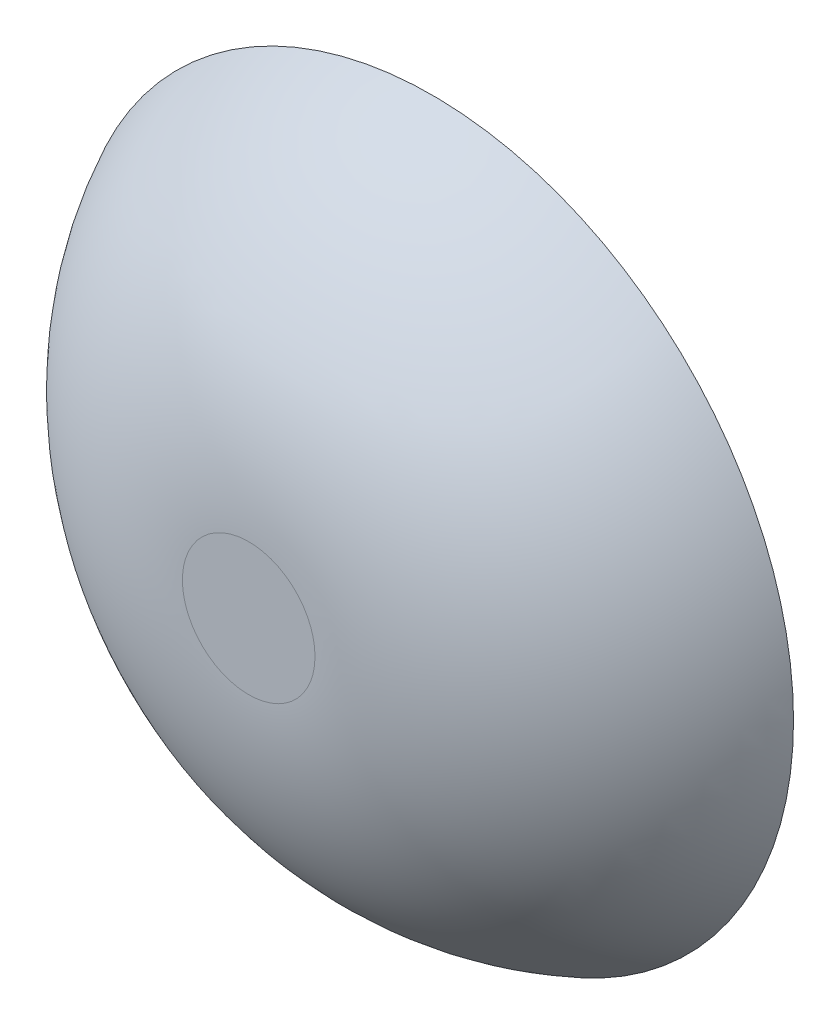
ISO-10303-21;
HEADER;
FILE_DESCRIPTION(('STEP AP214'),'2;1');
FILE_NAME('part.step','',(''),(''),'','','');
FILE_SCHEMA(('AUTOMOTIVE_DESIGN { 1 0 10303 214 1 1 1 1 }'));
ENDSEC;
DATA;
#1=APPLICATION_CONTEXT('core data for automotive mechanical design processes');
#2=APPLICATION_PROTOCOL_DEFINITION('international standard','automotive_design',2000,#1);
#3=PRODUCT_CONTEXT('',#1,'mechanical');
#4=PRODUCT('Part','Part','',(#3));
#5=PRODUCT_RELATED_PRODUCT_CATEGORY('part','',(#4));
#6=PRODUCT_DEFINITION_FORMATION('','',#4);
#7=PRODUCT_DEFINITION_CONTEXT('part definition',#1,'design');
#8=PRODUCT_DEFINITION('design','',#6,#7);
#9=PRODUCT_DEFINITION_SHAPE('','',#8);
#10=(LENGTH_UNIT() NAMED_UNIT(*) SI_UNIT(.MILLI.,.METRE.));
#11=(NAMED_UNIT(*) PLANE_ANGLE_UNIT() SI_UNIT($,.RADIAN.));
#12=(NAMED_UNIT(*) SI_UNIT($,.STERADIAN.) SOLID_ANGLE_UNIT());
#13=UNCERTAINTY_MEASURE_WITH_UNIT(LENGTH_MEASURE(1.E-05),#10,'distance_accuracy_value','');
#14=(GEOMETRIC_REPRESENTATION_CONTEXT(3) GLOBAL_UNCERTAINTY_ASSIGNED_CONTEXT((#13)) GLOBAL_UNIT_ASSIGNED_CONTEXT((#10,
#11,#12)) REPRESENTATION_CONTEXT('',''));
#15=CARTESIAN_POINT('',(0.,0.,0.));
#16=DIRECTION('',(0.,0.,1.));
#17=DIRECTION('',(1.,0.,0.));
#18=AXIS2_PLACEMENT_3D('',#15,#16,#17);
#19=CARTESIAN_POINT('',(0.,0.,2.8));
#20=DIRECTION('',(0.,0.,1.));
#21=DIRECTION('',(1.,0.,0.));
#22=AXIS2_PLACEMENT_3D('',#19,#20,#21);
#23=PLANE('',#22);
#24=CARTESIAN_POINT('',(0.,0.,2.8));
#25=DIRECTION('',(0.,0.,1.));
#26=DIRECTION('',(1.,0.,0.));
#27=AXIS2_PLACEMENT_3D('',#24,#25,#26);
#28=CIRCLE('',#27,1.01001113587127);
#29=CARTESIAN_POINT('',(1.01001113587127,0.,2.8));
#30=VERTEX_POINT('',#29);
#31=EDGE_CURVE('E10',#30,#30,#28,.T.);
#32=ORIENTED_EDGE('',*,*,#31,.T.);
#33=EDGE_LOOP('',(#32));
#34=FACE_BOUND('',#33,.T.);
#35=ADVANCED_FACE('F30',(#34),#23,.T.);
#36=CARTESIAN_POINT('',(0.,0.,0.));
#37=DIRECTION('',(0.,0.,1.));
#38=DIRECTION('',(1.,0.,0.));
#39=AXIS2_PLACEMENT_3D('',#36,#37,#38);
#40=PLANE('',#39);
#41=CARTESIAN_POINT('',(0.,0.,0.));
#42=DIRECTION('',(0.,0.,1.));
#43=DIRECTION('',(1.,0.,0.));
#44=AXIS2_PLACEMENT_3D('',#41,#42,#43);
#45=CIRCLE('',#44,5.5);
#46=CARTESIAN_POINT('',(5.5,0.,0.));
#47=VERTEX_POINT('',#46);
#48=EDGE_CURVE('E37',#47,#47,#45,.T.);
#49=ORIENTED_EDGE('',*,*,#48,.F.);
#50=EDGE_LOOP('',(#49));
#51=FACE_BOUND('',#50,.T.);
#52=ADVANCED_FACE('F45',(#51),#40,.F.);
#53=CARTESIAN_POINT('',(0.,0.,-2.2));
#54=DIRECTION('',(0.,0.,-1.));
#55=DIRECTION('',(-1.,0.,0.));
#56=AXIS2_PLACEMENT_3D('',#53,#54,#55);
#57=DEGENERATE_TOROIDAL_SURFACE('',#56,1.01001113587127,5.,.T.);
#58=ORIENTED_EDGE('',*,*,#48,.T.);
#59=EDGE_LOOP('',(#58));
#60=FACE_BOUND('',#59,.T.);
#61=ORIENTED_EDGE('',*,*,#31,.F.);
#62=EDGE_LOOP('',(#61));
#63=FACE_BOUND('',#62,.T.);
#64=ADVANCED_FACE('F32',(#60,#63),#57,.T.);
#65=CLOSED_SHELL('',(#35,#52,#64));
#66=MANIFOLD_SOLID_BREP('B2',#65);
#67=ADVANCED_BREP_SHAPE_REPRESENTATION('',(#18,#66),#14);
#68=SHAPE_DEFINITION_REPRESENTATION(#9,#67);
ENDSEC;
END-ISO-10303-21;
